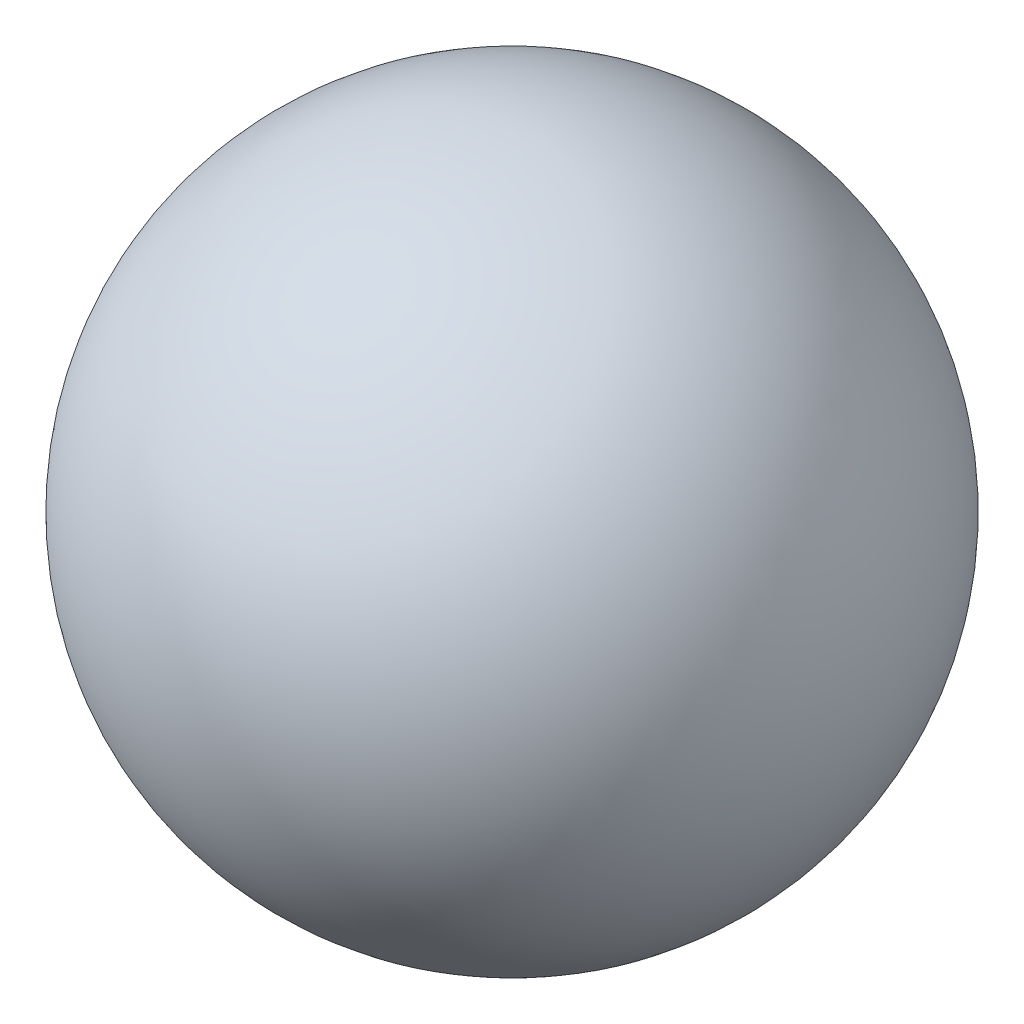
ISO-10303-21;
HEADER;
FILE_DESCRIPTION(('STEP AP214'),'2;1');
FILE_NAME('part.step','',(''),(''),'','','');
FILE_SCHEMA(('AUTOMOTIVE_DESIGN { 1 0 10303 214 1 1 1 1 }'));
ENDSEC;
DATA;
#1=APPLICATION_CONTEXT('core data for automotive mechanical design processes');
#2=APPLICATION_PROTOCOL_DEFINITION('international standard','automotive_design',2000,#1);
#3=PRODUCT_CONTEXT('',#1,'mechanical');
#4=PRODUCT('Part','Part','',(#3));
#5=PRODUCT_RELATED_PRODUCT_CATEGORY('part','',(#4));
#6=PRODUCT_DEFINITION_FORMATION('','',#4);
#7=PRODUCT_DEFINITION_CONTEXT('part definition',#1,'design');
#8=PRODUCT_DEFINITION('design','',#6,#7);
#9=PRODUCT_DEFINITION_SHAPE('','',#8);
#10=(LENGTH_UNIT() NAMED_UNIT(*) SI_UNIT(.MILLI.,.METRE.));
#11=(NAMED_UNIT(*) PLANE_ANGLE_UNIT() SI_UNIT($,.RADIAN.));
#12=(NAMED_UNIT(*) SI_UNIT($,.STERADIAN.) SOLID_ANGLE_UNIT());
#13=UNCERTAINTY_MEASURE_WITH_UNIT(LENGTH_MEASURE(1.E-05),#10,'distance_accuracy_value','');
#14=(GEOMETRIC_REPRESENTATION_CONTEXT(3) GLOBAL_UNCERTAINTY_ASSIGNED_CONTEXT((#13)) GLOBAL_UNIT_ASSIGNED_CONTEXT((#10,
#11,#12)) REPRESENTATION_CONTEXT('',''));
#15=CARTESIAN_POINT('',(0.,0.,0.));
#16=DIRECTION('',(0.,0.,1.));
#17=DIRECTION('',(1.,0.,0.));
#18=AXIS2_PLACEMENT_3D('',#15,#16,#17);
#19=CARTESIAN_POINT('',(0.,0.,0.));
#20=DIRECTION('',(0.,1.,0.));
#21=DIRECTION('',(1.,0.,0.));
#22=AXIS2_PLACEMENT_3D('',#19,#20,#21);
#23=SPHERICAL_SURFACE('',#22,101.6);
#24=CARTESIAN_POINT('',(0.,101.6,0.));
#25=VERTEX_POINT('',#24);
#26=VERTEX_LOOP('',#25);
#27=FACE_BOUND('',#26,.T.);
#28=ADVANCED_FACE('F31',(#27),#23,.T.);
#29=CLOSED_SHELL('',(#28));
#30=MANIFOLD_SOLID_BREP('B2',#29);
#31=ADVANCED_BREP_SHAPE_REPRESENTATION('',(#18,#30),#14);
#32=SHAPE_DEFINITION_REPRESENTATION(#9,#31);
ENDSEC;
END-ISO-10303-21;
